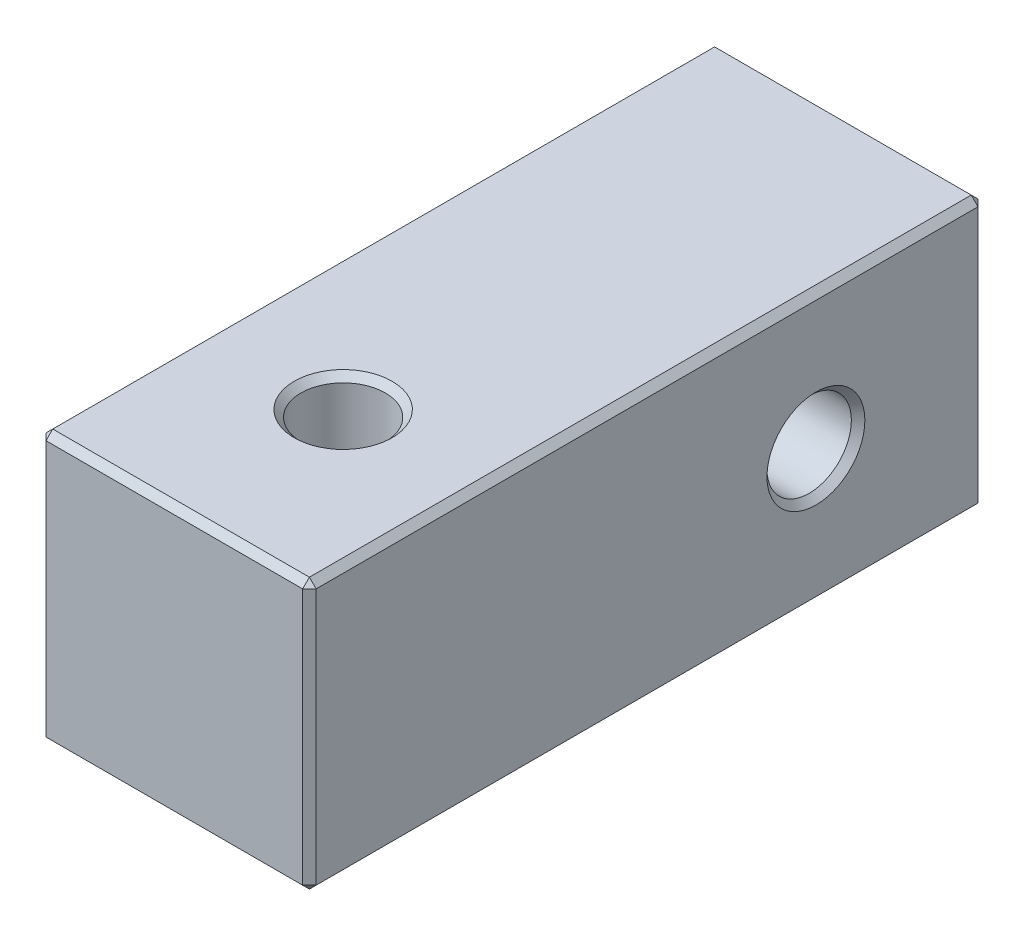
ISO-10303-21;
HEADER;
FILE_DESCRIPTION(('STEP AP214'),'2;1');
FILE_NAME('part.step','',(''),(''),'','','');
FILE_SCHEMA(('AUTOMOTIVE_DESIGN { 1 0 10303 214 1 1 1 1 }'));
ENDSEC;
DATA;
#1=APPLICATION_CONTEXT('core data for automotive mechanical design processes');
#2=APPLICATION_PROTOCOL_DEFINITION('international standard','automotive_design',2000,#1);
#3=PRODUCT_CONTEXT('',#1,'mechanical');
#4=PRODUCT('Part','Part','',(#3));
#5=PRODUCT_RELATED_PRODUCT_CATEGORY('part','',(#4));
#6=PRODUCT_DEFINITION_FORMATION('','',#4);
#7=PRODUCT_DEFINITION_CONTEXT('part definition',#1,'design');
#8=PRODUCT_DEFINITION('design','',#6,#7);
#9=PRODUCT_DEFINITION_SHAPE('','',#8);
#10=(LENGTH_UNIT() NAMED_UNIT(*) SI_UNIT(.MILLI.,.METRE.));
#11=(NAMED_UNIT(*) PLANE_ANGLE_UNIT() SI_UNIT($,.RADIAN.));
#12=(NAMED_UNIT(*) SI_UNIT($,.STERADIAN.) SOLID_ANGLE_UNIT());
#13=UNCERTAINTY_MEASURE_WITH_UNIT(LENGTH_MEASURE(1.E-05),#10,'distance_accuracy_value','');
#14=(GEOMETRIC_REPRESENTATION_CONTEXT(3) GLOBAL_UNCERTAINTY_ASSIGNED_CONTEXT((#13)) GLOBAL_UNIT_ASSIGNED_CONTEXT((#10,
#11,#12)) REPRESENTATION_CONTEXT('',''));
#15=CARTESIAN_POINT('',(0.,0.,0.));
#16=DIRECTION('',(0.,0.,1.));
#17=DIRECTION('',(1.,0.,0.));
#18=AXIS2_PLACEMENT_3D('',#15,#16,#17);
#19=CARTESIAN_POINT('',(4.,4.,10.));
#20=DIRECTION('',(-1.,0.,0.));
#21=DIRECTION('',(0.,-1.,0.));
#22=AXIS2_PLACEMENT_3D('',#19,#20,#21);
#23=PLANE('',#22);
#24=DIRECTION('',(0.,-1.,0.));
#25=VECTOR('',#24,1.);
#26=CARTESIAN_POINT('',(4.,-4.,9.8));
#27=LINE('',#26,#25);
#28=CARTESIAN_POINT('',(4.,3.8,9.8));
#29=VERTEX_POINT('',#28);
#30=CARTESIAN_POINT('',(4.,-3.8,9.8));
#31=VERTEX_POINT('',#30);
#32=EDGE_CURVE('E51',#29,#31,#27,.T.);
#33=ORIENTED_EDGE('',*,*,#32,.T.);
#34=DIRECTION('',(0.,0.,-1.));
#35=VECTOR('',#34,1.);
#36=CARTESIAN_POINT('',(4.,-3.8,10.));
#37=LINE('',#36,#35);
#38=CARTESIAN_POINT('',(4.,-3.8,-9.8));
#39=VERTEX_POINT('',#38);
#40=EDGE_CURVE('E11',#31,#39,#37,.T.);
#41=ORIENTED_EDGE('',*,*,#40,.T.);
#42=DIRECTION('',(0.,1.,0.));
#43=VECTOR('',#42,1.);
#44=CARTESIAN_POINT('',(4.,4.,-9.8));
#45=LINE('',#44,#43);
#46=CARTESIAN_POINT('',(4.,3.8,-9.8));
#47=VERTEX_POINT('',#46);
#48=EDGE_CURVE('E232',#39,#47,#45,.T.);
#49=ORIENTED_EDGE('',*,*,#48,.T.);
#50=DIRECTION('',(0.,0.,1.));
#51=VECTOR('',#50,1.);
#52=CARTESIAN_POINT('',(4.,3.8,10.));
#53=LINE('',#52,#51);
#54=EDGE_CURVE('E62',#47,#29,#53,.T.);
#55=ORIENTED_EDGE('',*,*,#54,.T.);
#56=EDGE_LOOP('',(#33,#41,#49,#55));
#57=FACE_BOUND('',#56,.T.);
#58=CARTESIAN_POINT('',(4.,0.,-5.));
#59=DIRECTION('',(-1.,0.,0.));
#60=DIRECTION('',(0.,-1.,0.));
#61=AXIS2_PLACEMENT_3D('',#58,#59,#60);
#62=CIRCLE('',#61,1.45);
#63=CARTESIAN_POINT('',(4.,-1.45,-5.));
#64=VERTEX_POINT('',#63);
#65=EDGE_CURVE('E229',#64,#64,#62,.T.);
#66=ORIENTED_EDGE('',*,*,#65,.T.);
#67=EDGE_LOOP('',(#66));
#68=FACE_BOUND('',#67,.T.);
#69=ADVANCED_FACE('F41',(#57,#68),#23,.F.);
#70=CARTESIAN_POINT('',(-4.,4.,10.));
#71=DIRECTION('',(0.,-1.,0.));
#72=DIRECTION('',(0.,0.,-1.));
#73=AXIS2_PLACEMENT_3D('',#70,#71,#72);
#74=PLANE('',#73);
#75=CARTESIAN_POINT('',(0.,4.,5.));
#76=DIRECTION('',(0.,-1.,0.));
#77=DIRECTION('',(0.,0.,-1.));
#78=AXIS2_PLACEMENT_3D('',#75,#76,#77);
#79=CIRCLE('',#78,1.44999999999998);
#80=CARTESIAN_POINT('',(0.,4.,3.55000000000002));
#81=VERTEX_POINT('',#80);
#82=EDGE_CURVE('E210',#81,#81,#79,.T.);
#83=ORIENTED_EDGE('',*,*,#82,.T.);
#84=EDGE_LOOP('',(#83));
#85=FACE_BOUND('',#84,.T.);
#86=DIRECTION('',(0.,0.,1.));
#87=VECTOR('',#86,1.);
#88=CARTESIAN_POINT('',(-3.8,4.,10.));
#89=LINE('',#88,#87);
#90=CARTESIAN_POINT('',(-3.8,4.,-9.8));
#91=VERTEX_POINT('',#90);
#92=CARTESIAN_POINT('',(-3.8,4.,9.8));
#93=VERTEX_POINT('',#92);
#94=EDGE_CURVE('E205',#91,#93,#89,.T.);
#95=ORIENTED_EDGE('',*,*,#94,.T.);
#96=DIRECTION('',(1.,0.,0.));
#97=VECTOR('',#96,1.);
#98=CARTESIAN_POINT('',(4.,4.,9.8));
#99=LINE('',#98,#97);
#100=CARTESIAN_POINT('',(3.8,4.,9.8));
#101=VERTEX_POINT('',#100);
#102=EDGE_CURVE('E207',#93,#101,#99,.T.);
#103=ORIENTED_EDGE('',*,*,#102,.T.);
#104=DIRECTION('',(0.,0.,-1.));
#105=VECTOR('',#104,1.);
#106=CARTESIAN_POINT('',(3.8,4.,10.));
#107=LINE('',#106,#105);
#108=CARTESIAN_POINT('',(3.8,4.,-9.8));
#109=VERTEX_POINT('',#108);
#110=EDGE_CURVE('E201',#101,#109,#107,.T.);
#111=ORIENTED_EDGE('',*,*,#110,.T.);
#112=DIRECTION('',(-1.,0.,0.));
#113=VECTOR('',#112,1.);
#114=CARTESIAN_POINT('',(-4.,4.,-9.8));
#115=LINE('',#114,#113);
#116=EDGE_CURVE('E203',#109,#91,#115,.T.);
#117=ORIENTED_EDGE('',*,*,#116,.T.);
#118=EDGE_LOOP('',(#95,#103,#111,#117));
#119=FACE_BOUND('',#118,.T.);
#120=ADVANCED_FACE('F332',(#85,#119),#74,.F.);
#121=CARTESIAN_POINT('',(-4.,4.,10.));
#122=DIRECTION('',(1.,0.,0.));
#123=DIRECTION('',(0.,1.,0.));
#124=AXIS2_PLACEMENT_3D('',#121,#122,#123);
#125=PLANE('',#124);
#126=CARTESIAN_POINT('',(-4.,0.,-5.));
#127=DIRECTION('',(1.,0.,0.));
#128=DIRECTION('',(0.,1.,0.));
#129=AXIS2_PLACEMENT_3D('',#126,#127,#128);
#130=CIRCLE('',#129,1.44999999999999);
#131=CARTESIAN_POINT('',(-4.,1.44999999999999,-5.));
#132=VERTEX_POINT('',#131);
#133=EDGE_CURVE('E192',#132,#132,#130,.T.);
#134=ORIENTED_EDGE('',*,*,#133,.T.);
#135=EDGE_LOOP('',(#134));
#136=FACE_BOUND('',#135,.T.);
#137=DIRECTION('',(0.,0.,1.));
#138=VECTOR('',#137,1.);
#139=CARTESIAN_POINT('',(-4.,-3.8,10.));
#140=LINE('',#139,#138);
#141=CARTESIAN_POINT('',(-4.,-3.8,-9.8));
#142=VERTEX_POINT('',#141);
#143=CARTESIAN_POINT('',(-4.,-3.8,9.8));
#144=VERTEX_POINT('',#143);
#145=EDGE_CURVE('E187',#142,#144,#140,.T.);
#146=ORIENTED_EDGE('',*,*,#145,.T.);
#147=DIRECTION('',(0.,1.,0.));
#148=VECTOR('',#147,1.);
#149=CARTESIAN_POINT('',(-4.,4.,9.8));
#150=LINE('',#149,#148);
#151=CARTESIAN_POINT('',(-4.,3.8,9.8));
#152=VERTEX_POINT('',#151);
#153=EDGE_CURVE('E189',#144,#152,#150,.T.);
#154=ORIENTED_EDGE('',*,*,#153,.T.);
#155=DIRECTION('',(0.,0.,-1.));
#156=VECTOR('',#155,1.);
#157=CARTESIAN_POINT('',(-4.,3.8,10.));
#158=LINE('',#157,#156);
#159=CARTESIAN_POINT('',(-4.,3.8,-9.8));
#160=VERTEX_POINT('',#159);
#161=EDGE_CURVE('E183',#152,#160,#158,.T.);
#162=ORIENTED_EDGE('',*,*,#161,.T.);
#163=DIRECTION('',(0.,-1.,0.));
#164=VECTOR('',#163,1.);
#165=CARTESIAN_POINT('',(-4.,4.,-9.8));
#166=LINE('',#165,#164);
#167=EDGE_CURVE('E185',#160,#142,#166,.T.);
#168=ORIENTED_EDGE('',*,*,#167,.T.);
#169=EDGE_LOOP('',(#146,#154,#162,#168));
#170=FACE_BOUND('',#169,.T.);
#171=ADVANCED_FACE('F360',(#136,#170),#125,.F.);
#172=CARTESIAN_POINT('',(-4.,-4.,10.));
#173=DIRECTION('',(0.,1.,0.));
#174=DIRECTION('',(0.,0.,1.));
#175=AXIS2_PLACEMENT_3D('',#172,#173,#174);
#176=PLANE('',#175);
#177=CARTESIAN_POINT('',(0.,-4.,5.));
#178=DIRECTION('',(0.,1.,0.));
#179=DIRECTION('',(0.,0.,1.));
#180=AXIS2_PLACEMENT_3D('',#177,#178,#179);
#181=CIRCLE('',#180,1.44999999999999);
#182=CARTESIAN_POINT('',(0.,-4.,6.44999999999999));
#183=VERTEX_POINT('',#182);
#184=EDGE_CURVE('E174',#183,#183,#181,.T.);
#185=ORIENTED_EDGE('',*,*,#184,.T.);
#186=EDGE_LOOP('',(#185));
#187=FACE_BOUND('',#186,.T.);
#188=DIRECTION('',(-1.,0.,0.));
#189=VECTOR('',#188,1.);
#190=CARTESIAN_POINT('',(-4.,-4.,9.8));
#191=LINE('',#190,#189);
#192=CARTESIAN_POINT('',(3.8,-4.,9.8));
#193=VERTEX_POINT('',#192);
#194=CARTESIAN_POINT('',(-3.8,-4.,9.8));
#195=VERTEX_POINT('',#194);
#196=EDGE_CURVE('E142',#193,#195,#191,.T.);
#197=ORIENTED_EDGE('',*,*,#196,.T.);
#198=DIRECTION('',(0.,0.,-1.));
#199=VECTOR('',#198,1.);
#200=CARTESIAN_POINT('',(-3.8,-4.,10.));
#201=LINE('',#200,#199);
#202=CARTESIAN_POINT('',(-3.8,-4.,-9.8));
#203=VERTEX_POINT('',#202);
#204=EDGE_CURVE('E138',#195,#203,#201,.T.);
#205=ORIENTED_EDGE('',*,*,#204,.T.);
#206=DIRECTION('',(1.,0.,0.));
#207=VECTOR('',#206,1.);
#208=CARTESIAN_POINT('',(-4.,-4.,-9.8));
#209=LINE('',#208,#207);
#210=CARTESIAN_POINT('',(3.8,-4.,-9.8));
#211=VERTEX_POINT('',#210);
#212=EDGE_CURVE('E130',#203,#211,#209,.T.);
#213=ORIENTED_EDGE('',*,*,#212,.T.);
#214=DIRECTION('',(0.,0.,1.));
#215=VECTOR('',#214,1.);
#216=CARTESIAN_POINT('',(3.8,-4.,10.));
#217=LINE('',#216,#215);
#218=EDGE_CURVE('E135',#211,#193,#217,.T.);
#219=ORIENTED_EDGE('',*,*,#218,.T.);
#220=EDGE_LOOP('',(#197,#205,#213,#219));
#221=FACE_BOUND('',#220,.T.);
#222=ADVANCED_FACE('F133',(#187,#221),#176,.F.);
#223=CARTESIAN_POINT('',(0.,0.,10.));
#224=DIRECTION('',(0.,0.,1.));
#225=DIRECTION('',(1.,0.,0.));
#226=AXIS2_PLACEMENT_3D('',#223,#224,#225);
#227=PLANE('',#226);
#228=DIRECTION('',(0.,-1.,0.));
#229=VECTOR('',#228,1.);
#230=CARTESIAN_POINT('',(-3.8,-4.,10.));
#231=LINE('',#230,#229);
#232=CARTESIAN_POINT('',(-3.8,3.8,10.));
#233=VERTEX_POINT('',#232);
#234=CARTESIAN_POINT('',(-3.8,-3.8,10.));
#235=VERTEX_POINT('',#234);
#236=EDGE_CURVE('E217',#233,#235,#231,.T.);
#237=ORIENTED_EDGE('',*,*,#236,.T.);
#238=DIRECTION('',(1.,0.,0.));
#239=VECTOR('',#238,1.);
#240=CARTESIAN_POINT('',(4.,-3.8,10.));
#241=LINE('',#240,#239);
#242=CARTESIAN_POINT('',(3.8,-3.8,10.));
#243=VERTEX_POINT('',#242);
#244=EDGE_CURVE('E219',#235,#243,#241,.T.);
#245=ORIENTED_EDGE('',*,*,#244,.T.);
#246=DIRECTION('',(0.,1.,0.));
#247=VECTOR('',#246,1.);
#248=CARTESIAN_POINT('',(3.8,4.,10.));
#249=LINE('',#248,#247);
#250=CARTESIAN_POINT('',(3.8,3.8,10.));
#251=VERTEX_POINT('',#250);
#252=EDGE_CURVE('E213',#243,#251,#249,.T.);
#253=ORIENTED_EDGE('',*,*,#252,.T.);
#254=DIRECTION('',(-1.,0.,0.));
#255=VECTOR('',#254,1.);
#256=CARTESIAN_POINT('',(-4.,3.8,10.));
#257=LINE('',#256,#255);
#258=EDGE_CURVE('E215',#251,#233,#257,.T.);
#259=ORIENTED_EDGE('',*,*,#258,.T.);
#260=EDGE_LOOP('',(#237,#245,#253,#259));
#261=FACE_BOUND('',#260,.T.);
#262=ADVANCED_FACE('F352',(#261),#227,.T.);
#263=CARTESIAN_POINT('',(0.,0.,-10.));
#264=DIRECTION('',(0.,0.,1.));
#265=DIRECTION('',(1.,0.,0.));
#266=AXIS2_PLACEMENT_3D('',#263,#264,#265);
#267=PLANE('',#266);
#268=DIRECTION('',(0.,-1.,0.));
#269=VECTOR('',#268,1.);
#270=CARTESIAN_POINT('',(3.8,0.,-10.));
#271=LINE('',#270,#269);
#272=CARTESIAN_POINT('',(3.8,3.8,-10.));
#273=VERTEX_POINT('',#272);
#274=CARTESIAN_POINT('',(3.8,-3.8,-10.));
#275=VERTEX_POINT('',#274);
#276=EDGE_CURVE('E222',#273,#275,#271,.T.);
#277=ORIENTED_EDGE('',*,*,#276,.T.);
#278=DIRECTION('',(-1.,0.,0.));
#279=VECTOR('',#278,1.);
#280=CARTESIAN_POINT('',(0.,-3.8,-10.));
#281=LINE('',#280,#279);
#282=CARTESIAN_POINT('',(-3.8,-3.8,-10.));
#283=VERTEX_POINT('',#282);
#284=EDGE_CURVE('E150',#275,#283,#281,.T.);
#285=ORIENTED_EDGE('',*,*,#284,.T.);
#286=DIRECTION('',(0.,1.,0.));
#287=VECTOR('',#286,1.);
#288=CARTESIAN_POINT('',(-3.8,0.,-10.));
#289=LINE('',#288,#287);
#290=CARTESIAN_POINT('',(-3.8,3.8,-10.));
#291=VERTEX_POINT('',#290);
#292=EDGE_CURVE('E226',#283,#291,#289,.T.);
#293=ORIENTED_EDGE('',*,*,#292,.T.);
#294=DIRECTION('',(1.,0.,0.));
#295=VECTOR('',#294,1.);
#296=CARTESIAN_POINT('',(0.,3.8,-10.));
#297=LINE('',#296,#295);
#298=EDGE_CURVE('E224',#291,#273,#297,.T.);
#299=ORIENTED_EDGE('',*,*,#298,.T.);
#300=EDGE_LOOP('',(#277,#285,#293,#299));
#301=FACE_BOUND('',#300,.T.);
#302=ADVANCED_FACE('F327',(#301),#267,.F.);
#303=CARTESIAN_POINT('',(4.,0.,-5.));
#304=DIRECTION('',(1.,0.,0.));
#305=DIRECTION('',(0.,0.,-1.));
#306=AXIS2_PLACEMENT_3D('',#303,#304,#305);
#307=CYLINDRICAL_SURFACE('',#306,1.25);
#308=CARTESIAN_POINT('',(-3.8,0.,-5.));
#309=DIRECTION('',(1.,0.,0.));
#310=DIRECTION('',(0.,0.,-1.));
#311=AXIS2_PLACEMENT_3D('',#308,#309,#310);
#312=CIRCLE('',#311,1.25);
#313=CARTESIAN_POINT('',(-3.8,0.,-6.25));
#314=VERTEX_POINT('',#313);
#315=EDGE_CURVE('E198',#314,#314,#312,.F.);
#316=ORIENTED_EDGE('',*,*,#315,.T.);
#317=EDGE_LOOP('',(#316));
#318=FACE_BOUND('',#317,.T.);
#319=CARTESIAN_POINT('',(3.8,0.,-5.));
#320=DIRECTION('',(-1.,0.,0.));
#321=DIRECTION('',(0.,0.,1.));
#322=AXIS2_PLACEMENT_3D('',#319,#320,#321);
#323=CIRCLE('',#322,1.25);
#324=CARTESIAN_POINT('',(3.8,0.,-3.75));
#325=VERTEX_POINT('',#324);
#326=EDGE_CURVE('E195',#325,#325,#323,.F.);
#327=ORIENTED_EDGE('',*,*,#326,.T.);
#328=EDGE_LOOP('',(#327));
#329=FACE_BOUND('',#328,.T.);
#330=ADVANCED_FACE('F340',(#318,#329),#307,.F.);
#331=CARTESIAN_POINT('',(0.,4.,5.));
#332=DIRECTION('',(0.,1.,0.));
#333=DIRECTION('',(0.,0.,1.));
#334=AXIS2_PLACEMENT_3D('',#331,#332,#333);
#335=CYLINDRICAL_SURFACE('',#334,1.24999999999999);
#336=CARTESIAN_POINT('',(0.,-3.8,5.));
#337=DIRECTION('',(0.,1.,0.));
#338=DIRECTION('',(0.,0.,1.));
#339=AXIS2_PLACEMENT_3D('',#336,#337,#338);
#340=CIRCLE('',#339,1.24999999999999);
#341=CARTESIAN_POINT('',(0.,-3.8,6.24999999999999));
#342=VERTEX_POINT('',#341);
#343=EDGE_CURVE('E180',#342,#342,#340,.F.);
#344=ORIENTED_EDGE('',*,*,#343,.T.);
#345=EDGE_LOOP('',(#344));
#346=FACE_BOUND('',#345,.T.);
#347=CARTESIAN_POINT('',(0.,3.80000000000001,5.));
#348=DIRECTION('',(0.,-1.,0.));
#349=DIRECTION('',(0.,0.,-1.));
#350=AXIS2_PLACEMENT_3D('',#347,#348,#349);
#351=CIRCLE('',#350,1.24999999999999);
#352=CARTESIAN_POINT('',(0.,3.80000000000001,3.75000000000001));
#353=VERTEX_POINT('',#352);
#354=EDGE_CURVE('E177',#353,#353,#351,.F.);
#355=ORIENTED_EDGE('',*,*,#354,.T.);
#356=EDGE_LOOP('',(#355));
#357=FACE_BOUND('',#356,.T.);
#358=ADVANCED_FACE('F342',(#346,#357),#335,.F.);
#359=CARTESIAN_POINT('',(0.,-4.,5.));
#360=DIRECTION('',(0.,-1.,0.));
#361=DIRECTION('',(0.,0.,-1.));
#362=AXIS2_PLACEMENT_3D('',#359,#360,#361);
#363=CONICAL_SURFACE('',#362,1.44999999999999,0.785398163397445);
#364=ORIENTED_EDGE('',*,*,#343,.F.);
#365=EDGE_LOOP('',(#364));
#366=FACE_BOUND('',#365,.T.);
#367=ORIENTED_EDGE('',*,*,#184,.F.);
#368=EDGE_LOOP('',(#367));
#369=FACE_BOUND('',#368,.T.);
#370=ADVANCED_FACE('F349',(#366,#369),#363,.F.);
#371=CARTESIAN_POINT('',(-4.,0.,-5.));
#372=DIRECTION('',(-1.,0.,0.));
#373=DIRECTION('',(0.,0.,1.));
#374=AXIS2_PLACEMENT_3D('',#371,#372,#373);
#375=CONICAL_SURFACE('',#374,1.44999999999999,0.785398163397443);
#376=ORIENTED_EDGE('',*,*,#315,.F.);
#377=EDGE_LOOP('',(#376));
#378=FACE_BOUND('',#377,.T.);
#379=ORIENTED_EDGE('',*,*,#133,.F.);
#380=EDGE_LOOP('',(#379));
#381=FACE_BOUND('',#380,.T.);
#382=ADVANCED_FACE('F374',(#378,#381),#375,.F.);
#383=CARTESIAN_POINT('',(0.,3.80000000000001,5.));
#384=DIRECTION('',(0.,1.,0.));
#385=DIRECTION('',(0.,0.,1.));
#386=AXIS2_PLACEMENT_3D('',#383,#384,#385);
#387=CONICAL_SURFACE('',#386,1.24999999999999,0.785398163397449);
#388=ORIENTED_EDGE('',*,*,#82,.F.);
#389=EDGE_LOOP('',(#388));
#390=FACE_BOUND('',#389,.T.);
#391=ORIENTED_EDGE('',*,*,#354,.F.);
#392=EDGE_LOOP('',(#391));
#393=FACE_BOUND('',#392,.T.);
#394=ADVANCED_FACE('F381',(#390,#393),#387,.F.);
#395=CARTESIAN_POINT('',(-4.,4.,-9.8));
#396=DIRECTION('',(0.,-0.707106781186548,0.707106781186548));
#397=DIRECTION('',(-1.,0.,0.));
#398=AXIS2_PLACEMENT_3D('',#395,#396,#397);
#399=PLANE('',#398);
#400=DIRECTION('',(0.,0.707106781186547,0.707106781186547));
#401=VECTOR('',#400,1.);
#402=CARTESIAN_POINT('',(-3.8,3.8,-10.));
#403=LINE('',#402,#401);
#404=EDGE_CURVE('E46',#91,#291,#403,.F.);
#405=ORIENTED_EDGE('',*,*,#404,.F.);
#406=ORIENTED_EDGE('',*,*,#116,.F.);
#407=DIRECTION('',(0.,-0.707106781186547,-0.707106781186547));
#408=VECTOR('',#407,1.);
#409=CARTESIAN_POINT('',(3.8,3.8,-10.));
#410=LINE('',#409,#408);
#411=EDGE_CURVE('E170',#273,#109,#410,.F.);
#412=ORIENTED_EDGE('',*,*,#411,.F.);
#413=ORIENTED_EDGE('',*,*,#298,.F.);
#414=EDGE_LOOP('',(#405,#406,#412,#413));
#415=FACE_BOUND('',#414,.T.);
#416=ADVANCED_FACE('F388',(#415),#399,.F.);
#417=CARTESIAN_POINT('',(-3.8,3.8,-10.));
#418=DIRECTION('',(-0.577350269189626,0.577350269189626,-0.577350269189626));
#419=DIRECTION('',(-0.707106781186548,0.,0.707106781186548));
#420=AXIS2_PLACEMENT_3D('',#417,#418,#419);
#421=PLANE('',#420);
#422=DIRECTION('',(-0.707106781186547,-0.707106781186547,0.));
#423=VECTOR('',#422,1.);
#424=CARTESIAN_POINT('',(-3.9,3.9,-9.8));
#425=LINE('',#424,#423);
#426=EDGE_CURVE('E277',#91,#160,#425,.T.);
#427=ORIENTED_EDGE('',*,*,#426,.F.);
#428=ORIENTED_EDGE('',*,*,#404,.T.);
#429=DIRECTION('',(0.707106781186548,0.,-0.707106781186548));
#430=VECTOR('',#429,1.);
#431=CARTESIAN_POINT('',(-3.8,3.8,-10.));
#432=LINE('',#431,#430);
#433=EDGE_CURVE('E280',#160,#291,#432,.T.);
#434=ORIENTED_EDGE('',*,*,#433,.F.);
#435=EDGE_LOOP('',(#427,#428,#434));
#436=FACE_BOUND('',#435,.T.);
#437=ADVANCED_FACE('F489',(#436),#421,.T.);
#438=CARTESIAN_POINT('',(3.8,3.8,-10.));
#439=DIRECTION('',(0.577350269189626,0.577350269189626,-0.577350269189626));
#440=DIRECTION('',(-0.707106781186548,0.,-0.707106781186548));
#441=AXIS2_PLACEMENT_3D('',#438,#439,#440);
#442=PLANE('',#441);
#443=DIRECTION('',(0.707106781186548,0.,0.707106781186548));
#444=VECTOR('',#443,1.);
#445=CARTESIAN_POINT('',(3.8,3.8,-10.));
#446=LINE('',#445,#444);
#447=EDGE_CURVE('E271',#273,#47,#446,.T.);
#448=ORIENTED_EDGE('',*,*,#447,.F.);
#449=ORIENTED_EDGE('',*,*,#411,.T.);
#450=DIRECTION('',(-0.707106781186547,0.707106781186547,0.));
#451=VECTOR('',#450,1.);
#452=CARTESIAN_POINT('',(3.9,3.9,-9.8));
#453=LINE('',#452,#451);
#454=EDGE_CURVE('E274',#47,#109,#453,.T.);
#455=ORIENTED_EDGE('',*,*,#454,.F.);
#456=EDGE_LOOP('',(#448,#449,#455));
#457=FACE_BOUND('',#456,.T.);
#458=ADVANCED_FACE('F287',(#457),#442,.T.);
#459=CARTESIAN_POINT('',(-4.,4.,-9.8));
#460=DIRECTION('',(0.707106781186548,0.,0.707106781186548));
#461=DIRECTION('',(0.,-1.,0.));
#462=AXIS2_PLACEMENT_3D('',#459,#460,#461);
#463=PLANE('',#462);
#464=ORIENTED_EDGE('',*,*,#433,.T.);
#465=ORIENTED_EDGE('',*,*,#292,.F.);
#466=DIRECTION('',(-0.707106781186547,0.,0.707106781186547));
#467=VECTOR('',#466,1.);
#468=CARTESIAN_POINT('',(-3.8,-3.8,-10.));
#469=LINE('',#468,#467);
#470=EDGE_CURVE('E267',#142,#283,#469,.F.);
#471=ORIENTED_EDGE('',*,*,#470,.F.);
#472=ORIENTED_EDGE('',*,*,#167,.F.);
#473=EDGE_LOOP('',(#464,#465,#471,#472));
#474=FACE_BOUND('',#473,.T.);
#475=ADVANCED_FACE('F323',(#474),#463,.F.);
#476=CARTESIAN_POINT('',(-4.,3.8,10.));
#477=DIRECTION('',(0.707106781186548,-0.707106781186548,0.));
#478=DIRECTION('',(0.,0.,-1.));
#479=AXIS2_PLACEMENT_3D('',#476,#477,#478);
#480=PLANE('',#479);
#481=ORIENTED_EDGE('',*,*,#426,.T.);
#482=ORIENTED_EDGE('',*,*,#161,.F.);
#483=DIRECTION('',(0.707106781186547,0.707106781186547,0.));
#484=VECTOR('',#483,1.);
#485=CARTESIAN_POINT('',(-4.,3.8,9.8));
#486=LINE('',#485,#484);
#487=EDGE_CURVE('E264',#93,#152,#486,.F.);
#488=ORIENTED_EDGE('',*,*,#487,.F.);
#489=ORIENTED_EDGE('',*,*,#94,.F.);
#490=EDGE_LOOP('',(#481,#482,#488,#489));
#491=FACE_BOUND('',#490,.T.);
#492=ADVANCED_FACE('F471',(#491),#480,.F.);
#493=CARTESIAN_POINT('',(0.,3.8,10.));
#494=DIRECTION('',(0.,0.707106781186548,0.707106781186548));
#495=DIRECTION('',(1.,0.,0.));
#496=AXIS2_PLACEMENT_3D('',#493,#494,#495);
#497=PLANE('',#496);
#498=DIRECTION('',(0.,-0.707106781186547,0.707106781186547));
#499=VECTOR('',#498,1.);
#500=CARTESIAN_POINT('',(3.8,4.,9.8));
#501=LINE('',#500,#499);
#502=EDGE_CURVE('E258',#101,#251,#501,.T.);
#503=ORIENTED_EDGE('',*,*,#502,.F.);
#504=ORIENTED_EDGE('',*,*,#102,.F.);
#505=DIRECTION('',(0.,0.707106781186547,-0.707106781186547));
#506=VECTOR('',#505,1.);
#507=CARTESIAN_POINT('',(-3.8,3.9,9.9));
#508=LINE('',#507,#506);
#509=EDGE_CURVE('E261',#233,#93,#508,.T.);
#510=ORIENTED_EDGE('',*,*,#509,.F.);
#511=ORIENTED_EDGE('',*,*,#258,.F.);
#512=EDGE_LOOP('',(#503,#504,#510,#511));
#513=FACE_BOUND('',#512,.T.);
#514=ADVANCED_FACE('F465',(#513),#497,.T.);
#515=CARTESIAN_POINT('',(3.8,4.,10.));
#516=DIRECTION('',(-0.707106781186548,-0.707106781186548,0.));
#517=DIRECTION('',(0.,0.,-1.));
#518=AXIS2_PLACEMENT_3D('',#515,#516,#517);
#519=PLANE('',#518);
#520=ORIENTED_EDGE('',*,*,#454,.T.);
#521=ORIENTED_EDGE('',*,*,#110,.F.);
#522=DIRECTION('',(0.707106781186547,-0.707106781186547,0.));
#523=VECTOR('',#522,1.);
#524=CARTESIAN_POINT('',(3.8,4.,9.8));
#525=LINE('',#524,#523);
#526=EDGE_CURVE('E256',#29,#101,#525,.F.);
#527=ORIENTED_EDGE('',*,*,#526,.F.);
#528=ORIENTED_EDGE('',*,*,#54,.F.);
#529=EDGE_LOOP('',(#520,#521,#527,#528));
#530=FACE_BOUND('',#529,.T.);
#531=ADVANCED_FACE('F294',(#530),#519,.F.);
#532=CARTESIAN_POINT('',(4.,4.,-9.8));
#533=DIRECTION('',(-0.707106781186548,0.,0.707106781186548));
#534=DIRECTION('',(0.,1.,0.));
#535=AXIS2_PLACEMENT_3D('',#532,#533,#534);
#536=PLANE('',#535);
#537=ORIENTED_EDGE('',*,*,#447,.T.);
#538=ORIENTED_EDGE('',*,*,#48,.F.);
#539=DIRECTION('',(-0.707106781186547,0.,-0.707106781186547));
#540=VECTOR('',#539,1.);
#541=CARTESIAN_POINT('',(3.9,-3.8,-9.9));
#542=LINE('',#541,#540);
#543=EDGE_CURVE('E154',#275,#39,#542,.F.);
#544=ORIENTED_EDGE('',*,*,#543,.F.);
#545=ORIENTED_EDGE('',*,*,#276,.F.);
#546=EDGE_LOOP('',(#537,#538,#544,#545));
#547=FACE_BOUND('',#546,.T.);
#548=ADVANCED_FACE('F329',(#547),#536,.F.);
#549=CARTESIAN_POINT('',(-4.,-4.,-9.8));
#550=DIRECTION('',(0.,0.707106781186548,0.707106781186548));
#551=DIRECTION('',(1.,0.,0.));
#552=AXIS2_PLACEMENT_3D('',#549,#550,#551);
#553=PLANE('',#552);
#554=DIRECTION('',(0.,0.707106781186547,-0.707106781186547));
#555=VECTOR('',#554,1.);
#556=CARTESIAN_POINT('',(-3.8,-3.8,-10.));
#557=LINE('',#556,#555);
#558=EDGE_CURVE('E269',#283,#203,#557,.F.);
#559=ORIENTED_EDGE('',*,*,#558,.F.);
#560=ORIENTED_EDGE('',*,*,#284,.F.);
#561=DIRECTION('',(0.,-0.707106781186547,0.707106781186547));
#562=VECTOR('',#561,1.);
#563=CARTESIAN_POINT('',(3.8,-4.,-9.8));
#564=LINE('',#563,#562);
#565=EDGE_CURVE('E146',#211,#275,#564,.F.);
#566=ORIENTED_EDGE('',*,*,#565,.F.);
#567=ORIENTED_EDGE('',*,*,#212,.F.);
#568=EDGE_LOOP('',(#559,#560,#566,#567));
#569=FACE_BOUND('',#568,.T.);
#570=ADVANCED_FACE('F148',(#569),#553,.F.);
#571=CARTESIAN_POINT('',(-3.8,-3.8,-10.));
#572=DIRECTION('',(-0.577350269189626,-0.577350269189626,-0.577350269189626));
#573=DIRECTION('',(-0.707106781186548,0.,0.707106781186548));
#574=AXIS2_PLACEMENT_3D('',#571,#572,#573);
#575=PLANE('',#574);
#576=ORIENTED_EDGE('',*,*,#470,.T.);
#577=ORIENTED_EDGE('',*,*,#558,.T.);
#578=DIRECTION('',(0.707106781186547,-0.707106781186547,0.));
#579=VECTOR('',#578,1.);
#580=CARTESIAN_POINT('',(-3.9,-3.9,-9.8));
#581=LINE('',#580,#579);
#582=EDGE_CURVE('E155',#142,#203,#581,.T.);
#583=ORIENTED_EDGE('',*,*,#582,.F.);
#584=EDGE_LOOP('',(#576,#577,#583));
#585=FACE_BOUND('',#584,.T.);
#586=ADVANCED_FACE('F319',(#585),#575,.T.);
#587=CARTESIAN_POINT('',(-4.,3.8,9.8));
#588=DIRECTION('',(-0.577350269189626,0.577350269189626,0.577350269189626));
#589=DIRECTION('',(0.707106781186548,0.,0.707106781186548));
#590=AXIS2_PLACEMENT_3D('',#587,#588,#589);
#591=PLANE('',#590);
#592=ORIENTED_EDGE('',*,*,#509,.T.);
#593=ORIENTED_EDGE('',*,*,#487,.T.);
#594=DIRECTION('',(0.707106781186548,0.,0.707106781186548));
#595=VECTOR('',#594,1.);
#596=CARTESIAN_POINT('',(-4.,3.8,9.8));
#597=LINE('',#596,#595);
#598=EDGE_CURVE('E251',#233,#152,#597,.F.);
#599=ORIENTED_EDGE('',*,*,#598,.F.);
#600=EDGE_LOOP('',(#592,#593,#599));
#601=FACE_BOUND('',#600,.T.);
#602=ADVANCED_FACE('F438',(#601),#591,.T.);
#603=CARTESIAN_POINT('',(3.8,4.,9.8));
#604=DIRECTION('',(0.577350269189626,0.577350269189626,0.577350269189626));
#605=DIRECTION('',(0.707106781186548,0.,-0.707106781186548));
#606=AXIS2_PLACEMENT_3D('',#603,#604,#605);
#607=PLANE('',#606);
#608=ORIENTED_EDGE('',*,*,#526,.T.);
#609=ORIENTED_EDGE('',*,*,#502,.T.);
#610=DIRECTION('',(0.707106781186548,0.,-0.707106781186548));
#611=VECTOR('',#610,1.);
#612=CARTESIAN_POINT('',(3.9,3.8,9.9));
#613=LINE('',#612,#611);
#614=EDGE_CURVE('E161',#29,#251,#613,.F.);
#615=ORIENTED_EDGE('',*,*,#614,.F.);
#616=EDGE_LOOP('',(#608,#609,#615));
#617=FACE_BOUND('',#616,.T.);
#618=ADVANCED_FACE('F298',(#617),#607,.T.);
#619=CARTESIAN_POINT('',(3.8,-4.,-9.8));
#620=DIRECTION('',(0.577350269189626,-0.577350269189626,-0.577350269189626));
#621=DIRECTION('',(-0.707106781186548,0.,-0.707106781186548));
#622=AXIS2_PLACEMENT_3D('',#619,#620,#621);
#623=PLANE('',#622);
#624=ORIENTED_EDGE('',*,*,#565,.T.);
#625=ORIENTED_EDGE('',*,*,#543,.T.);
#626=DIRECTION('',(0.707106781186547,0.707106781186547,0.));
#627=VECTOR('',#626,1.);
#628=CARTESIAN_POINT('',(3.8,-4.,-9.8));
#629=LINE('',#628,#627);
#630=EDGE_CURVE('E157',#211,#39,#629,.T.);
#631=ORIENTED_EDGE('',*,*,#630,.F.);
#632=EDGE_LOOP('',(#624,#625,#631));
#633=FACE_BOUND('',#632,.T.);
#634=ADVANCED_FACE('F158',(#633),#623,.T.);
#635=CARTESIAN_POINT('',(-3.8,-4.,10.));
#636=DIRECTION('',(0.707106781186548,0.707106781186548,0.));
#637=DIRECTION('',(0.,0.,-1.));
#638=AXIS2_PLACEMENT_3D('',#635,#636,#637);
#639=PLANE('',#638);
#640=ORIENTED_EDGE('',*,*,#582,.T.);
#641=ORIENTED_EDGE('',*,*,#204,.F.);
#642=DIRECTION('',(-0.707106781186547,0.707106781186547,0.));
#643=VECTOR('',#642,1.);
#644=CARTESIAN_POINT('',(-3.8,-4.,9.8));
#645=LINE('',#644,#643);
#646=EDGE_CURVE('E162',#144,#195,#645,.F.);
#647=ORIENTED_EDGE('',*,*,#646,.F.);
#648=ORIENTED_EDGE('',*,*,#145,.F.);
#649=EDGE_LOOP('',(#640,#641,#647,#648));
#650=FACE_BOUND('',#649,.T.);
#651=ADVANCED_FACE('F316',(#650),#639,.F.);
#652=CARTESIAN_POINT('',(-3.8,0.,10.));
#653=DIRECTION('',(-0.707106781186548,0.,0.707106781186548));
#654=DIRECTION('',(0.,1.,0.));
#655=AXIS2_PLACEMENT_3D('',#652,#653,#654);
#656=PLANE('',#655);
#657=ORIENTED_EDGE('',*,*,#598,.T.);
#658=ORIENTED_EDGE('',*,*,#153,.F.);
#659=DIRECTION('',(-0.707106781186547,0.,-0.707106781186547));
#660=VECTOR('',#659,1.);
#661=CARTESIAN_POINT('',(-3.9,-3.8,9.9));
#662=LINE('',#661,#660);
#663=EDGE_CURVE('E244',#235,#144,#662,.T.);
#664=ORIENTED_EDGE('',*,*,#663,.F.);
#665=ORIENTED_EDGE('',*,*,#236,.F.);
#666=EDGE_LOOP('',(#657,#658,#664,#665));
#667=FACE_BOUND('',#666,.T.);
#668=ADVANCED_FACE('F416',(#667),#656,.T.);
#669=CARTESIAN_POINT('',(3.8,0.,10.));
#670=DIRECTION('',(0.707106781186548,0.,0.707106781186548));
#671=DIRECTION('',(0.,-1.,0.));
#672=AXIS2_PLACEMENT_3D('',#669,#670,#671);
#673=PLANE('',#672);
#674=ORIENTED_EDGE('',*,*,#614,.T.);
#675=ORIENTED_EDGE('',*,*,#252,.F.);
#676=DIRECTION('',(-0.707106781186547,0.,0.707106781186547));
#677=VECTOR('',#676,1.);
#678=CARTESIAN_POINT('',(3.8,-3.8,10.));
#679=LINE('',#678,#677);
#680=EDGE_CURVE('E241',#31,#243,#679,.T.);
#681=ORIENTED_EDGE('',*,*,#680,.F.);
#682=ORIENTED_EDGE('',*,*,#32,.F.);
#683=EDGE_LOOP('',(#674,#675,#681,#682));
#684=FACE_BOUND('',#683,.T.);
#685=ADVANCED_FACE('F302',(#684),#673,.T.);
#686=CARTESIAN_POINT('',(4.,-3.8,10.));
#687=DIRECTION('',(-0.707106781186548,0.707106781186548,0.));
#688=DIRECTION('',(0.,0.,-1.));
#689=AXIS2_PLACEMENT_3D('',#686,#687,#688);
#690=PLANE('',#689);
#691=ORIENTED_EDGE('',*,*,#630,.T.);
#692=ORIENTED_EDGE('',*,*,#40,.F.);
#693=DIRECTION('',(-0.707106781186547,-0.707106781186547,0.));
#694=VECTOR('',#693,1.);
#695=CARTESIAN_POINT('',(3.9,-3.9,9.8));
#696=LINE('',#695,#694);
#697=EDGE_CURVE('E166',#193,#31,#696,.F.);
#698=ORIENTED_EDGE('',*,*,#697,.F.);
#699=ORIENTED_EDGE('',*,*,#218,.F.);
#700=EDGE_LOOP('',(#691,#692,#698,#699));
#701=FACE_BOUND('',#700,.T.);
#702=ADVANCED_FACE('F164',(#701),#690,.F.);
#703=CARTESIAN_POINT('',(-3.8,-4.,9.8));
#704=DIRECTION('',(-0.577350269189626,-0.577350269189626,0.577350269189626));
#705=DIRECTION('',(0.707106781186548,0.,0.707106781186548));
#706=AXIS2_PLACEMENT_3D('',#703,#704,#705);
#707=PLANE('',#706);
#708=ORIENTED_EDGE('',*,*,#663,.T.);
#709=ORIENTED_EDGE('',*,*,#646,.T.);
#710=DIRECTION('',(0.,0.707106781186547,0.707106781186547));
#711=VECTOR('',#710,1.);
#712=CARTESIAN_POINT('',(-3.8,-4.,9.8));
#713=LINE('',#712,#711);
#714=EDGE_CURVE('E238',#235,#195,#713,.F.);
#715=ORIENTED_EDGE('',*,*,#714,.F.);
#716=EDGE_LOOP('',(#708,#709,#715));
#717=FACE_BOUND('',#716,.T.);
#718=ADVANCED_FACE('F312',(#717),#707,.T.);
#719=CARTESIAN_POINT('',(3.8,-3.8,10.));
#720=DIRECTION('',(0.577350269189626,-0.577350269189626,0.577350269189626));
#721=DIRECTION('',(0.707106781186548,0.,-0.707106781186548));
#722=AXIS2_PLACEMENT_3D('',#719,#720,#721);
#723=PLANE('',#722);
#724=ORIENTED_EDGE('',*,*,#697,.T.);
#725=ORIENTED_EDGE('',*,*,#680,.T.);
#726=DIRECTION('',(0.,-0.707106781186547,-0.707106781186547));
#727=VECTOR('',#726,1.);
#728=CARTESIAN_POINT('',(3.8,-3.8,10.));
#729=LINE('',#728,#727);
#730=EDGE_CURVE('E236',#193,#243,#729,.F.);
#731=ORIENTED_EDGE('',*,*,#730,.F.);
#732=EDGE_LOOP('',(#724,#725,#731));
#733=FACE_BOUND('',#732,.T.);
#734=ADVANCED_FACE('F305',(#733),#723,.T.);
#735=CARTESIAN_POINT('',(0.,-3.8,10.));
#736=DIRECTION('',(0.,-0.707106781186548,0.707106781186548));
#737=DIRECTION('',(-1.,0.,0.));
#738=AXIS2_PLACEMENT_3D('',#735,#736,#737);
#739=PLANE('',#738);
#740=ORIENTED_EDGE('',*,*,#714,.T.);
#741=ORIENTED_EDGE('',*,*,#196,.F.);
#742=ORIENTED_EDGE('',*,*,#730,.T.);
#743=ORIENTED_EDGE('',*,*,#244,.F.);
#744=EDGE_LOOP('',(#740,#741,#742,#743));
#745=FACE_BOUND('',#744,.T.);
#746=ADVANCED_FACE('F308',(#745),#739,.T.);
#747=CARTESIAN_POINT('',(3.8,0.,-5.));
#748=DIRECTION('',(1.,0.,0.));
#749=DIRECTION('',(0.,0.,-1.));
#750=AXIS2_PLACEMENT_3D('',#747,#748,#749);
#751=CONICAL_SURFACE('',#750,1.25,0.785398163397445);
#752=ORIENTED_EDGE('',*,*,#65,.F.);
#753=EDGE_LOOP('',(#752));
#754=FACE_BOUND('',#753,.T.);
#755=ORIENTED_EDGE('',*,*,#326,.F.);
#756=EDGE_LOOP('',(#755));
#757=FACE_BOUND('',#756,.T.);
#758=ADVANCED_FACE('F44',(#754,#757),#751,.F.);
#759=CLOSED_SHELL('',(#69,#120,#171,#222,#262,#302,#330,#358,#370,#382,#394,#416,#437,#458,#475,
#492,#514,#531,#548,#570,#586,#602,#618,#634,#651,#668,#685,#702,#718,#734,#746,#758));
#760=MANIFOLD_SOLID_BREP('B2',#759);
#761=ADVANCED_BREP_SHAPE_REPRESENTATION('',(#18,#760),#14);
#762=SHAPE_DEFINITION_REPRESENTATION(#9,#761);
ENDSEC;
END-ISO-10303-21;
